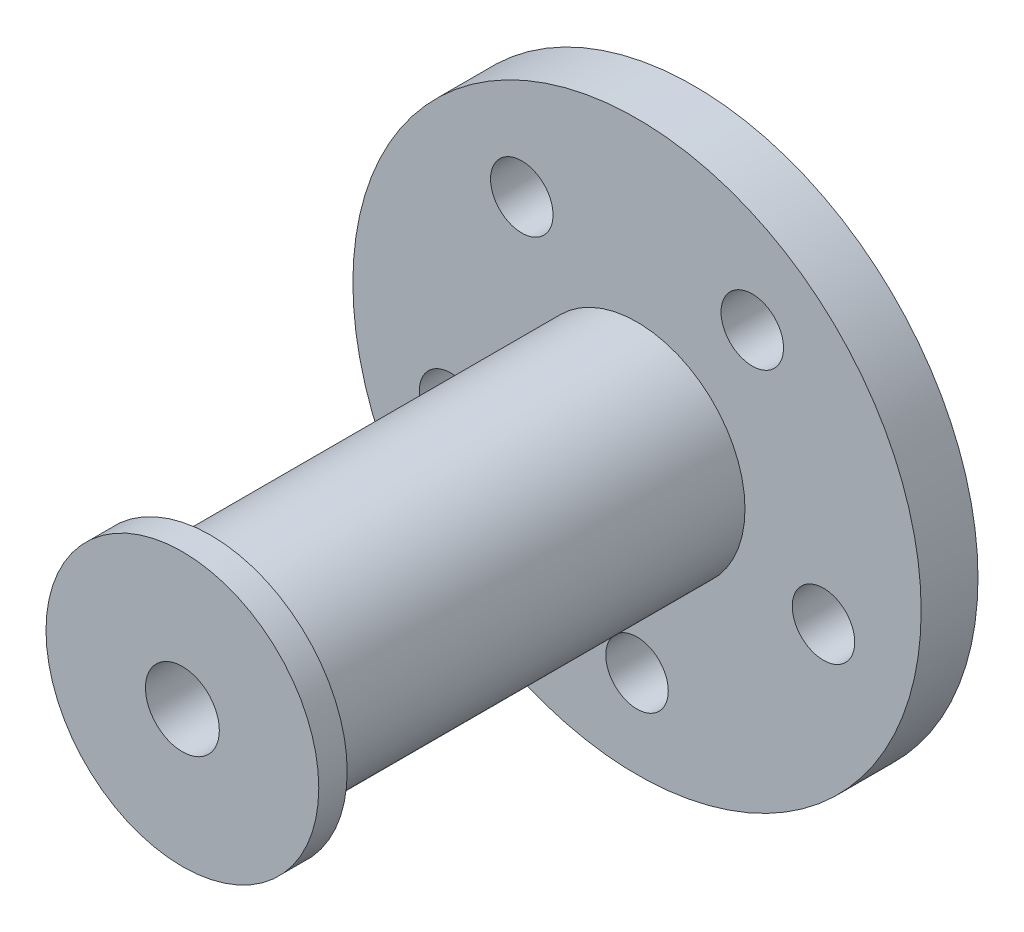
ISO-10303-21;
HEADER;
FILE_DESCRIPTION(('STEP AP214'),'2;1');
FILE_NAME('part.step','',(''),(''),'','','');
FILE_SCHEMA(('AUTOMOTIVE_DESIGN { 1 0 10303 214 1 1 1 1 }'));
ENDSEC;
DATA;
#1=APPLICATION_CONTEXT('core data for automotive mechanical design processes');
#2=APPLICATION_PROTOCOL_DEFINITION('international standard','automotive_design',2000,#1);
#3=PRODUCT_CONTEXT('',#1,'mechanical');
#4=PRODUCT('Part','Part','',(#3));
#5=PRODUCT_RELATED_PRODUCT_CATEGORY('part','',(#4));
#6=PRODUCT_DEFINITION_FORMATION('','',#4);
#7=PRODUCT_DEFINITION_CONTEXT('part definition',#1,'design');
#8=PRODUCT_DEFINITION('design','',#6,#7);
#9=PRODUCT_DEFINITION_SHAPE('','',#8);
#10=(LENGTH_UNIT() NAMED_UNIT(*) SI_UNIT(.MILLI.,.METRE.));
#11=(NAMED_UNIT(*) PLANE_ANGLE_UNIT() SI_UNIT($,.RADIAN.));
#12=(NAMED_UNIT(*) SI_UNIT($,.STERADIAN.) SOLID_ANGLE_UNIT());
#13=UNCERTAINTY_MEASURE_WITH_UNIT(LENGTH_MEASURE(1.E-05),#10,'distance_accuracy_value','');
#14=(GEOMETRIC_REPRESENTATION_CONTEXT(3) GLOBAL_UNCERTAINTY_ASSIGNED_CONTEXT((#13)) GLOBAL_UNIT_ASSIGNED_CONTEXT((#10,
#11,#12)) REPRESENTATION_CONTEXT('',''));
#15=CARTESIAN_POINT('',(0.,0.,0.));
#16=DIRECTION('',(0.,0.,1.));
#17=DIRECTION('',(1.,0.,0.));
#18=AXIS2_PLACEMENT_3D('',#15,#16,#17);
#19=CARTESIAN_POINT('',(0.,0.,0.));
#20=DIRECTION('',(0.,0.,1.));
#21=DIRECTION('',(1.,0.,0.));
#22=AXIS2_PLACEMENT_3D('',#19,#20,#21);
#23=CYLINDRICAL_SURFACE('',#22,3.048);
#24=CARTESIAN_POINT('',(0.,0.,0.));
#25=DIRECTION('',(0.,0.,1.));
#26=DIRECTION('',(1.,0.,0.));
#27=AXIS2_PLACEMENT_3D('',#24,#25,#26);
#28=CIRCLE('',#27,3.048);
#29=CARTESIAN_POINT('',(3.048,0.,0.));
#30=VERTEX_POINT('',#29);
#31=EDGE_CURVE('E93',#30,#30,#28,.T.);
#32=ORIENTED_EDGE('',*,*,#31,.F.);
#33=EDGE_LOOP('',(#32));
#34=FACE_BOUND('',#33,.T.);
#35=CARTESIAN_POINT('',(0.,0.,1.651));
#36=DIRECTION('',(0.,0.,1.));
#37=DIRECTION('',(1.,0.,0.));
#38=AXIS2_PLACEMENT_3D('',#35,#36,#37);
#39=CIRCLE('',#38,3.048);
#40=CARTESIAN_POINT('',(3.048,0.,1.651));
#41=VERTEX_POINT('',#40);
#42=EDGE_CURVE('E128',#41,#41,#39,.T.);
#43=ORIENTED_EDGE('',*,*,#42,.T.);
#44=EDGE_LOOP('',(#43));
#45=FACE_BOUND('',#44,.T.);
#46=ADVANCED_FACE('F43',(#34,#45),#23,.F.);
#47=CARTESIAN_POINT('',(0.,0.,57.15));
#48=DIRECTION('',(0.,0.,-1.));
#49=DIRECTION('',(-1.,0.,0.));
#50=AXIS2_PLACEMENT_3D('',#47,#48,#49);
#51=CYLINDRICAL_SURFACE('',#50,12.065);
#52=CARTESIAN_POINT('',(0.,0.,6.35));
#53=DIRECTION('',(0.,0.,1.));
#54=DIRECTION('',(1.,0.,0.));
#55=AXIS2_PLACEMENT_3D('',#52,#53,#54);
#56=CIRCLE('',#55,12.065);
#57=CARTESIAN_POINT('',(12.065,0.,6.35));
#58=VERTEX_POINT('',#57);
#59=EDGE_CURVE('E51',#58,#58,#56,.T.);
#60=ORIENTED_EDGE('',*,*,#59,.T.);
#61=EDGE_LOOP('',(#60));
#62=FACE_BOUND('',#61,.T.);
#63=CARTESIAN_POINT('',(0.,0.,53.975));
#64=DIRECTION('',(0.,0.,1.));
#65=DIRECTION('',(1.,0.,0.));
#66=AXIS2_PLACEMENT_3D('',#63,#64,#65);
#67=CIRCLE('',#66,12.065);
#68=CARTESIAN_POINT('',(12.065,0.,53.975));
#69=VERTEX_POINT('',#68);
#70=EDGE_CURVE('E10',#69,#69,#67,.T.);
#71=ORIENTED_EDGE('',*,*,#70,.F.);
#72=EDGE_LOOP('',(#71));
#73=FACE_BOUND('',#72,.T.);
#74=ADVANCED_FACE('F171',(#62,#73),#51,.T.);
#75=CARTESIAN_POINT('',(0.,0.,6.35));
#76=DIRECTION('',(0.,0.,-1.));
#77=DIRECTION('',(-1.,0.,0.));
#78=AXIS2_PLACEMENT_3D('',#75,#76,#77);
#79=CYLINDRICAL_SURFACE('',#78,31.75);
#80=CARTESIAN_POINT('',(0.,0.,6.35));
#81=DIRECTION('',(0.,0.,1.));
#82=DIRECTION('',(1.,0.,0.));
#83=AXIS2_PLACEMENT_3D('',#80,#81,#82);
#84=CIRCLE('',#83,31.75);
#85=CARTESIAN_POINT('',(31.75,0.,6.35));
#86=VERTEX_POINT('',#85);
#87=EDGE_CURVE('E56',#86,#86,#84,.T.);
#88=ORIENTED_EDGE('',*,*,#87,.F.);
#89=EDGE_LOOP('',(#88));
#90=FACE_BOUND('',#89,.T.);
#91=CARTESIAN_POINT('',(0.,0.,0.));
#92=DIRECTION('',(0.,0.,1.));
#93=DIRECTION('',(1.,0.,0.));
#94=AXIS2_PLACEMENT_3D('',#91,#92,#93);
#95=CIRCLE('',#94,31.75);
#96=CARTESIAN_POINT('',(31.75,0.,0.));
#97=VERTEX_POINT('',#96);
#98=EDGE_CURVE('E62',#97,#97,#95,.T.);
#99=ORIENTED_EDGE('',*,*,#98,.T.);
#100=EDGE_LOOP('',(#99));
#101=FACE_BOUND('',#100,.T.);
#102=ADVANCED_FACE('F45',(#90,#101),#79,.T.);
#103=CARTESIAN_POINT('',(0.,0.,6.35));
#104=DIRECTION('',(0.,0.,1.));
#105=DIRECTION('',(1.,0.,0.));
#106=AXIS2_PLACEMENT_3D('',#103,#104,#105);
#107=PLANE('',#106);
#108=CARTESIAN_POINT('',(20.8352706307361,-6.7697898042691,6.35));
#109=DIRECTION('',(0.,0.,1.));
#110=DIRECTION('',(0.309016994374945,0.951056516295155,0.));
#111=AXIS2_PLACEMENT_3D('',#108,#109,#110);
#112=CIRCLE('',#111,3.4925);
#113=CARTESIAN_POINT('',(21.9145124835906,-3.44822492110827,6.35));
#114=VERTEX_POINT('',#113);
#115=EDGE_CURVE('E113',#114,#114,#112,.T.);
#116=ORIENTED_EDGE('',*,*,#115,.F.);
#117=EDGE_LOOP('',(#116));
#118=FACE_BOUND('',#117,.T.);
#119=CARTESIAN_POINT('',(12.8769054145973,17.7235398042692,6.35));
#120=DIRECTION('',(0.,0.,1.));
#121=DIRECTION('',(-0.809016994374951,0.587785252292469,0.));
#122=AXIS2_PLACEMENT_3D('',#119,#120,#121);
#123=CIRCLE('',#122,3.4925);
#124=CARTESIAN_POINT('',(10.0514135617427,19.7763797979007,6.35));
#125=VERTEX_POINT('',#124);
#126=EDGE_CURVE('E105',#125,#125,#123,.T.);
#127=ORIENTED_EDGE('',*,*,#126,.F.);
#128=EDGE_LOOP('',(#127));
#129=FACE_BOUND('',#128,.T.);
#130=CARTESIAN_POINT('',(-12.8769054145975,17.723539804269,6.35));
#131=DIRECTION('',(0.,0.,1.));
#132=DIRECTION('',(-0.809016994374942,-0.58778525229248,0.));
#133=AXIS2_PLACEMENT_3D('',#130,#131,#132);
#134=CIRCLE('',#133,3.4925);
#135=CARTESIAN_POINT('',(-15.702397267452,15.6706998106376,6.35));
#136=VERTEX_POINT('',#135);
#137=EDGE_CURVE('E97',#136,#136,#134,.T.);
#138=ORIENTED_EDGE('',*,*,#137,.F.);
#139=EDGE_LOOP('',(#138));
#140=FACE_BOUND('',#139,.T.);
#141=CARTESIAN_POINT('',(-20.835270630736,-6.7697898042694,6.35));
#142=DIRECTION('',(0.,0.,1.));
#143=DIRECTION('',(0.309016994374958,-0.95105651629515,0.));
#144=AXIS2_PLACEMENT_3D('',#141,#142,#143);
#145=CIRCLE('',#144,3.4925);
#146=CARTESIAN_POINT('',(-19.7560287778815,-10.0913546874302,6.35));
#147=VERTEX_POINT('',#146);
#148=EDGE_CURVE('E88',#147,#147,#145,.T.);
#149=ORIENTED_EDGE('',*,*,#148,.F.);
#150=EDGE_LOOP('',(#149));
#151=FACE_BOUND('',#150,.T.);
#152=CARTESIAN_POINT('',(0.,-21.9075,6.35));
#153=DIRECTION('',(0.,0.,1.));
#154=DIRECTION('',(1.,0.,0.));
#155=AXIS2_PLACEMENT_3D('',#152,#153,#154);
#156=CIRCLE('',#155,3.4925);
#157=CARTESIAN_POINT('',(3.4925,-21.9075,6.35));
#158=VERTEX_POINT('',#157);
#159=EDGE_CURVE('E80',#158,#158,#156,.T.);
#160=ORIENTED_EDGE('',*,*,#159,.F.);
#161=EDGE_LOOP('',(#160));
#162=FACE_BOUND('',#161,.T.);
#163=ORIENTED_EDGE('',*,*,#59,.F.);
#164=EDGE_LOOP('',(#163));
#165=FACE_BOUND('',#164,.T.);
#166=ORIENTED_EDGE('',*,*,#87,.T.);
#167=EDGE_LOOP('',(#166));
#168=FACE_BOUND('',#167,.T.);
#169=ADVANCED_FACE('F168',(#118,#129,#140,#151,#162,#165,#168),#107,.T.);
#170=CARTESIAN_POINT('',(0.,0.,0.));
#171=DIRECTION('',(0.,0.,1.));
#172=DIRECTION('',(1.,0.,0.));
#173=AXIS2_PLACEMENT_3D('',#170,#171,#172);
#174=PLANE('',#173);
#175=ORIENTED_EDGE('',*,*,#31,.T.);
#176=EDGE_LOOP('',(#175));
#177=FACE_BOUND('',#176,.T.);
#178=CARTESIAN_POINT('',(20.8352706307361,-6.7697898042691,0.));
#179=DIRECTION('',(0.,0.,1.));
#180=DIRECTION('',(0.309016994374945,0.951056516295155,0.));
#181=AXIS2_PLACEMENT_3D('',#178,#179,#180);
#182=CIRCLE('',#181,3.4925);
#183=CARTESIAN_POINT('',(21.9145124835906,-3.44822492110827,0.));
#184=VERTEX_POINT('',#183);
#185=EDGE_CURVE('E84',#184,#184,#182,.T.);
#186=ORIENTED_EDGE('',*,*,#185,.T.);
#187=EDGE_LOOP('',(#186));
#188=FACE_BOUND('',#187,.T.);
#189=CARTESIAN_POINT('',(12.8769054145973,17.7235398042692,0.));
#190=DIRECTION('',(0.,0.,1.));
#191=DIRECTION('',(-0.809016994374951,0.587785252292469,0.));
#192=AXIS2_PLACEMENT_3D('',#189,#190,#191);
#193=CIRCLE('',#192,3.4925);
#194=CARTESIAN_POINT('',(10.0514135617427,19.7763797979007,0.));
#195=VERTEX_POINT('',#194);
#196=EDGE_CURVE('E109',#195,#195,#193,.T.);
#197=ORIENTED_EDGE('',*,*,#196,.T.);
#198=EDGE_LOOP('',(#197));
#199=FACE_BOUND('',#198,.T.);
#200=CARTESIAN_POINT('',(-12.8769054145975,17.723539804269,0.));
#201=DIRECTION('',(0.,0.,1.));
#202=DIRECTION('',(-0.809016994374942,-0.58778525229248,0.));
#203=AXIS2_PLACEMENT_3D('',#200,#201,#202);
#204=CIRCLE('',#203,3.4925);
#205=CARTESIAN_POINT('',(-15.702397267452,15.6706998106376,0.));
#206=VERTEX_POINT('',#205);
#207=EDGE_CURVE('E101',#206,#206,#204,.T.);
#208=ORIENTED_EDGE('',*,*,#207,.T.);
#209=EDGE_LOOP('',(#208));
#210=FACE_BOUND('',#209,.T.);
#211=CARTESIAN_POINT('',(-20.835270630736,-6.7697898042694,0.));
#212=DIRECTION('',(0.,0.,1.));
#213=DIRECTION('',(0.309016994374958,-0.95105651629515,0.));
#214=AXIS2_PLACEMENT_3D('',#211,#212,#213);
#215=CIRCLE('',#214,3.4925);
#216=CARTESIAN_POINT('',(-19.7560287778815,-10.0913546874302,0.));
#217=VERTEX_POINT('',#216);
#218=EDGE_CURVE('E92',#217,#217,#215,.T.);
#219=ORIENTED_EDGE('',*,*,#218,.T.);
#220=EDGE_LOOP('',(#219));
#221=FACE_BOUND('',#220,.T.);
#222=CARTESIAN_POINT('',(0.,-21.9075,0.));
#223=DIRECTION('',(0.,0.,1.));
#224=DIRECTION('',(1.,0.,0.));
#225=AXIS2_PLACEMENT_3D('',#222,#223,#224);
#226=CIRCLE('',#225,3.4925);
#227=CARTESIAN_POINT('',(3.4925,-21.9075,0.));
#228=VERTEX_POINT('',#227);
#229=EDGE_CURVE('E78',#228,#228,#226,.T.);
#230=ORIENTED_EDGE('',*,*,#229,.T.);
#231=EDGE_LOOP('',(#230));
#232=FACE_BOUND('',#231,.T.);
#233=ORIENTED_EDGE('',*,*,#98,.F.);
#234=EDGE_LOOP('',(#233));
#235=FACE_BOUND('',#234,.T.);
#236=ADVANCED_FACE('F160',(#177,#188,#199,#210,#221,#232,#235),#174,.F.);
#237=CARTESIAN_POINT('',(0.,0.,53.975));
#238=DIRECTION('',(0.,0.,1.));
#239=DIRECTION('',(1.,0.,0.));
#240=AXIS2_PLACEMENT_3D('',#237,#238,#239);
#241=CYLINDRICAL_SURFACE('',#240,15.24);
#242=CARTESIAN_POINT('',(0.,0.,53.975));
#243=DIRECTION('',(0.,0.,1.));
#244=DIRECTION('',(1.,0.,0.));
#245=AXIS2_PLACEMENT_3D('',#242,#243,#244);
#246=CIRCLE('',#245,15.24);
#247=CARTESIAN_POINT('',(15.24,0.,53.975));
#248=VERTEX_POINT('',#247);
#249=EDGE_CURVE('E69',#248,#248,#246,.T.);
#250=ORIENTED_EDGE('',*,*,#249,.T.);
#251=EDGE_LOOP('',(#250));
#252=FACE_BOUND('',#251,.T.);
#253=CARTESIAN_POINT('',(0.,0.,57.15));
#254=DIRECTION('',(0.,0.,1.));
#255=DIRECTION('',(1.,0.,0.));
#256=AXIS2_PLACEMENT_3D('',#253,#254,#255);
#257=CIRCLE('',#256,15.24);
#258=CARTESIAN_POINT('',(15.24,0.,57.15));
#259=VERTEX_POINT('',#258);
#260=EDGE_CURVE('E65',#259,#259,#257,.T.);
#261=ORIENTED_EDGE('',*,*,#260,.F.);
#262=EDGE_LOOP('',(#261));
#263=FACE_BOUND('',#262,.T.);
#264=ADVANCED_FACE('F158',(#252,#263),#241,.T.);
#265=CARTESIAN_POINT('',(0.,0.,53.975));
#266=DIRECTION('',(0.,0.,1.));
#267=DIRECTION('',(1.,0.,0.));
#268=AXIS2_PLACEMENT_3D('',#265,#266,#267);
#269=PLANE('',#268);
#270=ORIENTED_EDGE('',*,*,#70,.T.);
#271=EDGE_LOOP('',(#270));
#272=FACE_BOUND('',#271,.T.);
#273=ORIENTED_EDGE('',*,*,#249,.F.);
#274=EDGE_LOOP('',(#273));
#275=FACE_BOUND('',#274,.T.);
#276=ADVANCED_FACE('F154',(#272,#275),#269,.F.);
#277=CARTESIAN_POINT('',(0.,0.,57.15));
#278=DIRECTION('',(0.,0.,1.));
#279=DIRECTION('',(1.,0.,0.));
#280=AXIS2_PLACEMENT_3D('',#277,#278,#279);
#281=PLANE('',#280);
#282=CARTESIAN_POINT('',(0.,0.,57.15));
#283=DIRECTION('',(0.,0.,1.));
#284=DIRECTION('',(1.,0.,0.));
#285=AXIS2_PLACEMENT_3D('',#282,#283,#284);
#286=CIRCLE('',#285,4.1275);
#287=CARTESIAN_POINT('',(4.1275,0.,57.15));
#288=VERTEX_POINT('',#287);
#289=EDGE_CURVE('E124',#288,#288,#286,.T.);
#290=ORIENTED_EDGE('',*,*,#289,.F.);
#291=EDGE_LOOP('',(#290));
#292=FACE_BOUND('',#291,.T.);
#293=ORIENTED_EDGE('',*,*,#260,.T.);
#294=EDGE_LOOP('',(#293));
#295=FACE_BOUND('',#294,.T.);
#296=ADVANCED_FACE('F150',(#292,#295),#281,.T.);
#297=CARTESIAN_POINT('',(0.,-21.9075,0.));
#298=DIRECTION('',(0.,0.,1.));
#299=DIRECTION('',(1.,0.,0.));
#300=AXIS2_PLACEMENT_3D('',#297,#298,#299);
#301=CYLINDRICAL_SURFACE('',#300,3.4925);
#302=ORIENTED_EDGE('',*,*,#229,.F.);
#303=EDGE_LOOP('',(#302));
#304=FACE_BOUND('',#303,.T.);
#305=ORIENTED_EDGE('',*,*,#159,.T.);
#306=EDGE_LOOP('',(#305));
#307=FACE_BOUND('',#306,.T.);
#308=ADVANCED_FACE('F153',(#304,#307),#301,.F.);
#309=CARTESIAN_POINT('',(-20.835270630736,-6.7697898042694,0.));
#310=DIRECTION('',(0.,0.,1.));
#311=DIRECTION('',(1.,0.,0.));
#312=AXIS2_PLACEMENT_3D('',#309,#310,#311);
#313=CYLINDRICAL_SURFACE('',#312,3.4925);
#314=ORIENTED_EDGE('',*,*,#218,.F.);
#315=EDGE_LOOP('',(#314));
#316=FACE_BOUND('',#315,.T.);
#317=ORIENTED_EDGE('',*,*,#148,.T.);
#318=EDGE_LOOP('',(#317));
#319=FACE_BOUND('',#318,.T.);
#320=ADVANCED_FACE('F189',(#316,#319),#313,.F.);
#321=CARTESIAN_POINT('',(-12.8769054145975,17.723539804269,0.));
#322=DIRECTION('',(0.,0.,1.));
#323=DIRECTION('',(1.,0.,0.));
#324=AXIS2_PLACEMENT_3D('',#321,#322,#323);
#325=CYLINDRICAL_SURFACE('',#324,3.4925);
#326=ORIENTED_EDGE('',*,*,#207,.F.);
#327=EDGE_LOOP('',(#326));
#328=FACE_BOUND('',#327,.T.);
#329=ORIENTED_EDGE('',*,*,#137,.T.);
#330=EDGE_LOOP('',(#329));
#331=FACE_BOUND('',#330,.T.);
#332=ADVANCED_FACE('F185',(#328,#331),#325,.F.);
#333=CARTESIAN_POINT('',(12.8769054145973,17.7235398042692,0.));
#334=DIRECTION('',(0.,0.,1.));
#335=DIRECTION('',(1.,0.,0.));
#336=AXIS2_PLACEMENT_3D('',#333,#334,#335);
#337=CYLINDRICAL_SURFACE('',#336,3.4925);
#338=ORIENTED_EDGE('',*,*,#196,.F.);
#339=EDGE_LOOP('',(#338));
#340=FACE_BOUND('',#339,.T.);
#341=ORIENTED_EDGE('',*,*,#126,.T.);
#342=EDGE_LOOP('',(#341));
#343=FACE_BOUND('',#342,.T.);
#344=ADVANCED_FACE('F181',(#340,#343),#337,.F.);
#345=CARTESIAN_POINT('',(20.8352706307361,-6.7697898042691,0.));
#346=DIRECTION('',(0.,0.,1.));
#347=DIRECTION('',(1.,0.,0.));
#348=AXIS2_PLACEMENT_3D('',#345,#346,#347);
#349=CYLINDRICAL_SURFACE('',#348,3.4925);
#350=ORIENTED_EDGE('',*,*,#185,.F.);
#351=EDGE_LOOP('',(#350));
#352=FACE_BOUND('',#351,.T.);
#353=ORIENTED_EDGE('',*,*,#115,.T.);
#354=EDGE_LOOP('',(#353));
#355=FACE_BOUND('',#354,.T.);
#356=ADVANCED_FACE('F146',(#352,#355),#349,.F.);
#357=CARTESIAN_POINT('',(0.,0.,1.651));
#358=DIRECTION('',(0.,0.,1.));
#359=DIRECTION('',(1.,0.,0.));
#360=AXIS2_PLACEMENT_3D('',#357,#358,#359);
#361=CYLINDRICAL_SURFACE('',#360,4.1275);
#362=CARTESIAN_POINT('',(0.,0.,1.651));
#363=DIRECTION('',(0.,0.,1.));
#364=DIRECTION('',(1.,0.,0.));
#365=AXIS2_PLACEMENT_3D('',#362,#363,#364);
#366=CIRCLE('',#365,4.1275);
#367=CARTESIAN_POINT('',(4.1275,0.,1.651));
#368=VERTEX_POINT('',#367);
#369=EDGE_CURVE('E123',#368,#368,#366,.T.);
#370=ORIENTED_EDGE('',*,*,#369,.F.);
#371=EDGE_LOOP('',(#370));
#372=FACE_BOUND('',#371,.T.);
#373=ORIENTED_EDGE('',*,*,#289,.T.);
#374=EDGE_LOOP('',(#373));
#375=FACE_BOUND('',#374,.T.);
#376=ADVANCED_FACE('F140',(#372,#375),#361,.F.);
#377=CARTESIAN_POINT('',(0.,0.,1.651));
#378=DIRECTION('',(0.,0.,1.));
#379=DIRECTION('',(1.,0.,0.));
#380=AXIS2_PLACEMENT_3D('',#377,#378,#379);
#381=PLANE('',#380);
#382=ORIENTED_EDGE('',*,*,#42,.F.);
#383=EDGE_LOOP('',(#382));
#384=FACE_BOUND('',#383,.T.);
#385=ORIENTED_EDGE('',*,*,#369,.T.);
#386=EDGE_LOOP('',(#385));
#387=FACE_BOUND('',#386,.T.);
#388=ADVANCED_FACE('F137',(#384,#387),#381,.T.);
#389=CLOSED_SHELL('',(#46,#74,#102,#169,#236,#264,#276,#296,#308,#320,#332,#344,#356,#376,#388));
#390=MANIFOLD_SOLID_BREP('B2',#389);
#391=ADVANCED_BREP_SHAPE_REPRESENTATION('',(#18,#390),#14);
#392=SHAPE_DEFINITION_REPRESENTATION(#9,#391);
ENDSEC;
END-ISO-10303-21;
